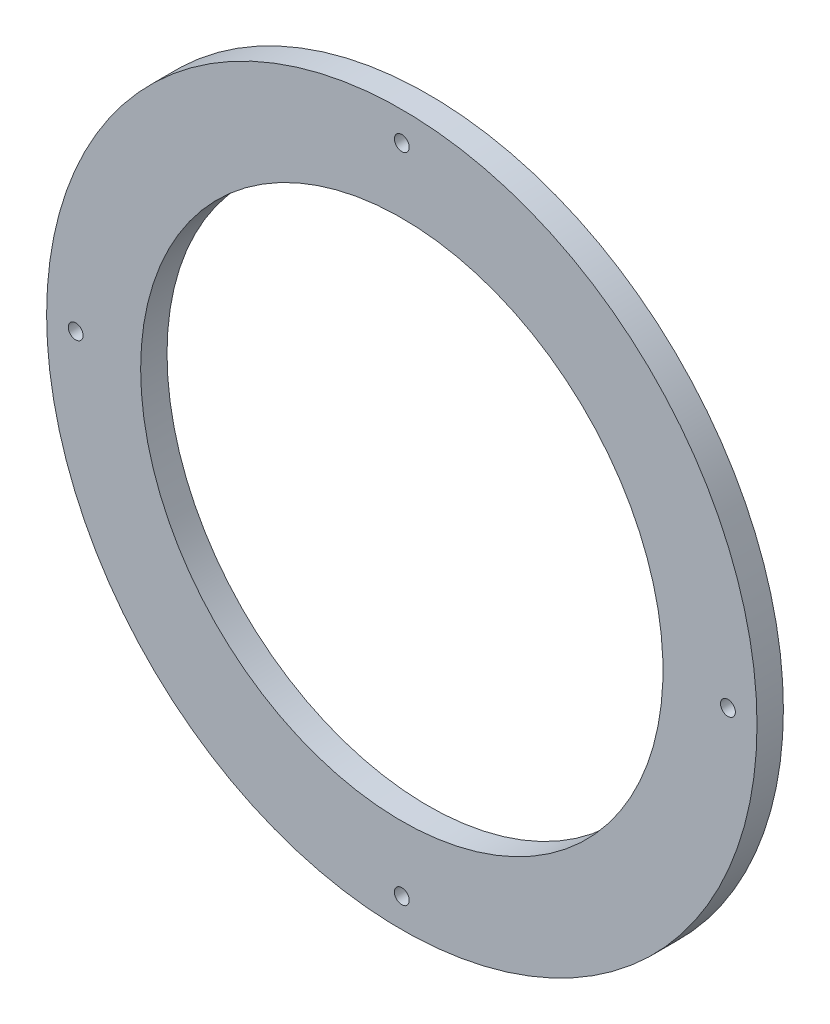
ISO-10303-21;
HEADER;
FILE_DESCRIPTION(('STEP AP214'),'2;1');
FILE_NAME('part.step','',(''),(''),'','','');
FILE_SCHEMA(('AUTOMOTIVE_DESIGN { 1 0 10303 214 1 1 1 1 }'));
ENDSEC;
DATA;
#1=APPLICATION_CONTEXT('core data for automotive mechanical design processes');
#2=APPLICATION_PROTOCOL_DEFINITION('international standard','automotive_design',2000,#1);
#3=PRODUCT_CONTEXT('',#1,'mechanical');
#4=PRODUCT('Part','Part','',(#3));
#5=PRODUCT_RELATED_PRODUCT_CATEGORY('part','',(#4));
#6=PRODUCT_DEFINITION_FORMATION('','',#4);
#7=PRODUCT_DEFINITION_CONTEXT('part definition',#1,'design');
#8=PRODUCT_DEFINITION('design','',#6,#7);
#9=PRODUCT_DEFINITION_SHAPE('','',#8);
#10=(LENGTH_UNIT() NAMED_UNIT(*) SI_UNIT(.MILLI.,.METRE.));
#11=(NAMED_UNIT(*) PLANE_ANGLE_UNIT() SI_UNIT($,.RADIAN.));
#12=(NAMED_UNIT(*) SI_UNIT($,.STERADIAN.) SOLID_ANGLE_UNIT());
#13=UNCERTAINTY_MEASURE_WITH_UNIT(LENGTH_MEASURE(1.E-05),#10,'distance_accuracy_value','');
#14=(GEOMETRIC_REPRESENTATION_CONTEXT(3) GLOBAL_UNCERTAINTY_ASSIGNED_CONTEXT((#13)) GLOBAL_UNIT_ASSIGNED_CONTEXT((#10,
#11,#12)) REPRESENTATION_CONTEXT('',''));
#15=CARTESIAN_POINT('',(0.,0.,0.));
#16=DIRECTION('',(0.,0.,1.));
#17=DIRECTION('',(1.,0.,0.));
#18=AXIS2_PLACEMENT_3D('',#15,#16,#17);
#19=CARTESIAN_POINT('',(0.,0.,6.35));
#20=DIRECTION('',(0.,0.,1.));
#21=DIRECTION('',(1.,0.,0.));
#22=AXIS2_PLACEMENT_3D('',#19,#20,#21);
#23=PLANE('',#22);
#24=CARTESIAN_POINT('',(0.,0.,6.35));
#25=DIRECTION('',(0.,0.,-1.));
#26=DIRECTION('',(-1.,0.,0.));
#27=AXIS2_PLACEMENT_3D('',#24,#25,#26);
#28=CIRCLE('',#27,62.865);
#29=CARTESIAN_POINT('',(-62.865,0.,6.35));
#30=VERTEX_POINT('',#29);
#31=EDGE_CURVE('E92',#30,#30,#28,.T.);
#32=ORIENTED_EDGE('',*,*,#31,.T.);
#33=EDGE_LOOP('',(#32));
#34=FACE_BOUND('',#33,.T.);
#35=CARTESIAN_POINT('',(2.80000286194751E-08,-78.5,6.35));
#36=DIRECTION('',(0.,0.,1.));
#37=DIRECTION('',(1.,0.,0.));
#38=AXIS2_PLACEMENT_3D('',#35,#36,#37);
#39=CIRCLE('',#38,1.7859375);
#40=CARTESIAN_POINT('',(1.78593752800003,-78.5,6.35));
#41=VERTEX_POINT('',#40);
#42=EDGE_CURVE('E80',#41,#41,#39,.T.);
#43=ORIENTED_EDGE('',*,*,#42,.F.);
#44=EDGE_LOOP('',(#43));
#45=FACE_BOUND('',#44,.T.);
#46=CARTESIAN_POINT('',(2.34568847912113E-13,78.499999972,6.35));
#47=DIRECTION('',(0.,0.,1.));
#48=DIRECTION('',(1.,0.,0.));
#49=AXIS2_PLACEMENT_3D('',#46,#47,#48);
#50=CIRCLE('',#49,1.7859375);
#51=CARTESIAN_POINT('',(1.78593750000024,78.499999972,6.35));
#52=VERTEX_POINT('',#51);
#53=EDGE_CURVE('E69',#52,#52,#50,.T.);
#54=ORIENTED_EDGE('',*,*,#53,.F.);
#55=EDGE_LOOP('',(#54));
#56=FACE_BOUND('',#55,.T.);
#57=CARTESIAN_POINT('',(0.,0.,6.35));
#58=DIRECTION('',(0.,0.,1.));
#59=DIRECTION('',(1.,0.,0.));
#60=AXIS2_PLACEMENT_3D('',#57,#58,#59);
#61=CIRCLE('',#60,85.5);
#62=CARTESIAN_POINT('',(85.5,0.,6.35));
#63=VERTEX_POINT('',#62);
#64=EDGE_CURVE('E11',#63,#63,#61,.T.);
#65=ORIENTED_EDGE('',*,*,#64,.T.);
#66=EDGE_LOOP('',(#65));
#67=FACE_BOUND('',#66,.T.);
#68=CARTESIAN_POINT('',(78.5,0.,6.35));
#69=DIRECTION('',(0.,0.,1.));
#70=DIRECTION('',(1.,0.,0.));
#71=AXIS2_PLACEMENT_3D('',#68,#69,#70);
#72=CIRCLE('',#71,1.7859375);
#73=CARTESIAN_POINT('',(80.2859375,0.,6.35));
#74=VERTEX_POINT('',#73);
#75=EDGE_CURVE('E74',#74,#74,#72,.T.);
#76=ORIENTED_EDGE('',*,*,#75,.F.);
#77=EDGE_LOOP('',(#76));
#78=FACE_BOUND('',#77,.T.);
#79=CARTESIAN_POINT('',(-78.499999972,-2.80000326310231E-08,6.35));
#80=DIRECTION('',(0.,0.,1.));
#81=DIRECTION('',(1.,0.,0.));
#82=AXIS2_PLACEMENT_3D('',#79,#80,#81);
#83=CIRCLE('',#82,1.7859375);
#84=CARTESIAN_POINT('',(-76.714062472,-2.80000326310231E-08,6.35));
#85=VERTEX_POINT('',#84);
#86=EDGE_CURVE('E86',#85,#85,#83,.T.);
#87=ORIENTED_EDGE('',*,*,#86,.F.);
#88=EDGE_LOOP('',(#87));
#89=FACE_BOUND('',#88,.T.);
#90=ADVANCED_FACE('F58',(#34,#45,#56,#67,#78,#89),#23,.T.);
#91=CARTESIAN_POINT('',(0.,0.,0.));
#92=DIRECTION('',(0.,0.,1.));
#93=DIRECTION('',(1.,0.,0.));
#94=AXIS2_PLACEMENT_3D('',#91,#92,#93);
#95=PLANE('',#94);
#96=CARTESIAN_POINT('',(0.,0.,0.));
#97=DIRECTION('',(0.,0.,-1.));
#98=DIRECTION('',(-1.,0.,0.));
#99=AXIS2_PLACEMENT_3D('',#96,#97,#98);
#100=CIRCLE('',#99,62.865);
#101=CARTESIAN_POINT('',(-62.865,0.,0.));
#102=VERTEX_POINT('',#101);
#103=EDGE_CURVE('E95',#102,#102,#100,.T.);
#104=ORIENTED_EDGE('',*,*,#103,.F.);
#105=EDGE_LOOP('',(#104));
#106=FACE_BOUND('',#105,.T.);
#107=CARTESIAN_POINT('',(0.,0.,0.));
#108=DIRECTION('',(0.,0.,1.));
#109=DIRECTION('',(1.,0.,0.));
#110=AXIS2_PLACEMENT_3D('',#107,#108,#109);
#111=CIRCLE('',#110,85.5);
#112=CARTESIAN_POINT('',(85.5,0.,0.));
#113=VERTEX_POINT('',#112);
#114=EDGE_CURVE('E62',#113,#113,#111,.T.);
#115=ORIENTED_EDGE('',*,*,#114,.F.);
#116=EDGE_LOOP('',(#115));
#117=FACE_BOUND('',#116,.T.);
#118=CARTESIAN_POINT('',(2.34568847912113E-13,78.499999972,0.));
#119=DIRECTION('',(0.,0.,1.));
#120=DIRECTION('',(1.,0.,0.));
#121=AXIS2_PLACEMENT_3D('',#118,#119,#120);
#122=CIRCLE('',#121,1.7859375);
#123=CARTESIAN_POINT('',(1.78593750000024,78.499999972,0.));
#124=VERTEX_POINT('',#123);
#125=EDGE_CURVE('E71',#124,#124,#122,.T.);
#126=ORIENTED_EDGE('',*,*,#125,.T.);
#127=EDGE_LOOP('',(#126));
#128=FACE_BOUND('',#127,.T.);
#129=CARTESIAN_POINT('',(78.5,0.,0.));
#130=DIRECTION('',(0.,0.,1.));
#131=DIRECTION('',(1.,0.,0.));
#132=AXIS2_PLACEMENT_3D('',#129,#130,#131);
#133=CIRCLE('',#132,1.7859375);
#134=CARTESIAN_POINT('',(80.2859375,0.,0.));
#135=VERTEX_POINT('',#134);
#136=EDGE_CURVE('E77',#135,#135,#133,.T.);
#137=ORIENTED_EDGE('',*,*,#136,.T.);
#138=EDGE_LOOP('',(#137));
#139=FACE_BOUND('',#138,.T.);
#140=CARTESIAN_POINT('',(2.80000286194751E-08,-78.5,0.));
#141=DIRECTION('',(0.,0.,1.));
#142=DIRECTION('',(1.,0.,0.));
#143=AXIS2_PLACEMENT_3D('',#140,#141,#142);
#144=CIRCLE('',#143,1.7859375);
#145=CARTESIAN_POINT('',(1.78593752800003,-78.5,0.));
#146=VERTEX_POINT('',#145);
#147=EDGE_CURVE('E83',#146,#146,#144,.T.);
#148=ORIENTED_EDGE('',*,*,#147,.T.);
#149=EDGE_LOOP('',(#148));
#150=FACE_BOUND('',#149,.T.);
#151=CARTESIAN_POINT('',(-78.499999972,-2.80000326310231E-08,0.));
#152=DIRECTION('',(0.,0.,1.));
#153=DIRECTION('',(1.,0.,0.));
#154=AXIS2_PLACEMENT_3D('',#151,#152,#153);
#155=CIRCLE('',#154,1.7859375);
#156=CARTESIAN_POINT('',(-76.714062472,-2.80000326310231E-08,0.));
#157=VERTEX_POINT('',#156);
#158=EDGE_CURVE('E89',#157,#157,#155,.T.);
#159=ORIENTED_EDGE('',*,*,#158,.T.);
#160=EDGE_LOOP('',(#159));
#161=FACE_BOUND('',#160,.T.);
#162=ADVANCED_FACE('F110',(#106,#117,#128,#139,#150,#161),#95,.F.);
#163=CARTESIAN_POINT('',(0.,0.,6.35));
#164=DIRECTION('',(0.,0.,-1.));
#165=DIRECTION('',(-1.,0.,0.));
#166=AXIS2_PLACEMENT_3D('',#163,#164,#165);
#167=CYLINDRICAL_SURFACE('',#166,85.5);
#168=ORIENTED_EDGE('',*,*,#64,.F.);
#169=EDGE_LOOP('',(#168));
#170=FACE_BOUND('',#169,.T.);
#171=ORIENTED_EDGE('',*,*,#114,.T.);
#172=EDGE_LOOP('',(#171));
#173=FACE_BOUND('',#172,.T.);
#174=ADVANCED_FACE('F60',(#170,#173),#167,.T.);
#175=CARTESIAN_POINT('',(2.34568847912113E-13,78.499999972,6.35));
#176=DIRECTION('',(0.,0.,-1.));
#177=DIRECTION('',(-1.,0.,0.));
#178=AXIS2_PLACEMENT_3D('',#175,#176,#177);
#179=CYLINDRICAL_SURFACE('',#178,1.7859375);
#180=ORIENTED_EDGE('',*,*,#53,.T.);
#181=EDGE_LOOP('',(#180));
#182=FACE_BOUND('',#181,.T.);
#183=ORIENTED_EDGE('',*,*,#125,.F.);
#184=EDGE_LOOP('',(#183));
#185=FACE_BOUND('',#184,.T.);
#186=ADVANCED_FACE('F138',(#182,#185),#179,.F.);
#187=CARTESIAN_POINT('',(78.5,0.,6.35));
#188=DIRECTION('',(0.,0.,-1.));
#189=DIRECTION('',(-1.,0.,0.));
#190=AXIS2_PLACEMENT_3D('',#187,#188,#189);
#191=CYLINDRICAL_SURFACE('',#190,1.7859375);
#192=ORIENTED_EDGE('',*,*,#75,.T.);
#193=EDGE_LOOP('',(#192));
#194=FACE_BOUND('',#193,.T.);
#195=ORIENTED_EDGE('',*,*,#136,.F.);
#196=EDGE_LOOP('',(#195));
#197=FACE_BOUND('',#196,.T.);
#198=ADVANCED_FACE('F130',(#194,#197),#191,.F.);
#199=CARTESIAN_POINT('',(2.80000286194751E-08,-78.5,6.35));
#200=DIRECTION('',(0.,0.,-1.));
#201=DIRECTION('',(-1.,0.,0.));
#202=AXIS2_PLACEMENT_3D('',#199,#200,#201);
#203=CYLINDRICAL_SURFACE('',#202,1.7859375);
#204=ORIENTED_EDGE('',*,*,#42,.T.);
#205=EDGE_LOOP('',(#204));
#206=FACE_BOUND('',#205,.T.);
#207=ORIENTED_EDGE('',*,*,#147,.F.);
#208=EDGE_LOOP('',(#207));
#209=FACE_BOUND('',#208,.T.);
#210=ADVANCED_FACE('F124',(#206,#209),#203,.F.);
#211=CARTESIAN_POINT('',(-78.499999972,-2.80000326310231E-08,6.35));
#212=DIRECTION('',(0.,0.,-1.));
#213=DIRECTION('',(-1.,0.,0.));
#214=AXIS2_PLACEMENT_3D('',#211,#212,#213);
#215=CYLINDRICAL_SURFACE('',#214,1.7859375);
#216=ORIENTED_EDGE('',*,*,#86,.T.);
#217=EDGE_LOOP('',(#216));
#218=FACE_BOUND('',#217,.T.);
#219=ORIENTED_EDGE('',*,*,#158,.F.);
#220=EDGE_LOOP('',(#219));
#221=FACE_BOUND('',#220,.T.);
#222=ADVANCED_FACE('F106',(#218,#221),#215,.F.);
#223=CARTESIAN_POINT('',(0.,0.,6.35));
#224=DIRECTION('',(0.,0.,-1.));
#225=DIRECTION('',(-1.,0.,0.));
#226=AXIS2_PLACEMENT_3D('',#223,#224,#225);
#227=CYLINDRICAL_SURFACE('',#226,62.865);
#228=ORIENTED_EDGE('',*,*,#31,.F.);
#229=EDGE_LOOP('',(#228));
#230=FACE_BOUND('',#229,.T.);
#231=ORIENTED_EDGE('',*,*,#103,.T.);
#232=EDGE_LOOP('',(#231));
#233=FACE_BOUND('',#232,.T.);
#234=ADVANCED_FACE('F103',(#230,#233),#227,.F.);
#235=CLOSED_SHELL('',(#90,#162,#174,#186,#198,#210,#222,#234));
#236=MANIFOLD_SOLID_BREP('B2',#235);
#237=ADVANCED_BREP_SHAPE_REPRESENTATION('',(#18,#236),#14);
#238=SHAPE_DEFINITION_REPRESENTATION(#9,#237);
ENDSEC;
END-ISO-10303-21;
